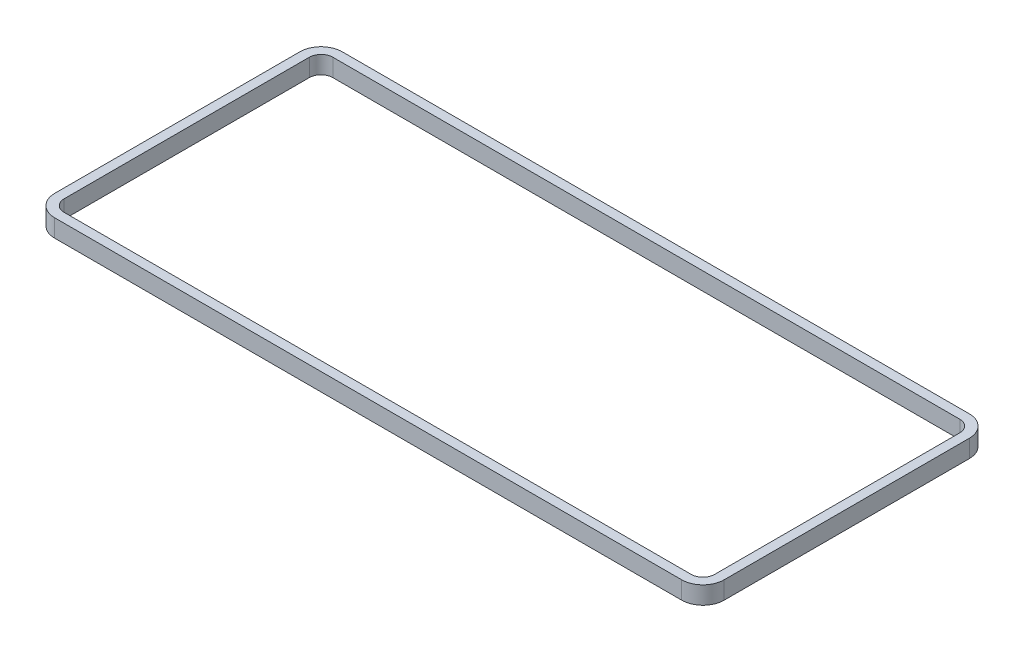
ISO-10303-21;
HEADER;
FILE_DESCRIPTION(('STEP AP214'),'2;1');
FILE_NAME('part.step','',(''),(''),'','','');
FILE_SCHEMA(('AUTOMOTIVE_DESIGN { 1 0 10303 214 1 1 1 1 }'));
ENDSEC;
DATA;
#1=APPLICATION_CONTEXT('core data for automotive mechanical design processes');
#2=APPLICATION_PROTOCOL_DEFINITION('international standard','automotive_design',2000,#1);
#3=PRODUCT_CONTEXT('',#1,'mechanical');
#4=PRODUCT('Part','Part','',(#3));
#5=PRODUCT_RELATED_PRODUCT_CATEGORY('part','',(#4));
#6=PRODUCT_DEFINITION_FORMATION('','',#4);
#7=PRODUCT_DEFINITION_CONTEXT('part definition',#1,'design');
#8=PRODUCT_DEFINITION('design','',#6,#7);
#9=PRODUCT_DEFINITION_SHAPE('','',#8);
#10=(LENGTH_UNIT() NAMED_UNIT(*) SI_UNIT(.MILLI.,.METRE.));
#11=(NAMED_UNIT(*) PLANE_ANGLE_UNIT() SI_UNIT($,.RADIAN.));
#12=(NAMED_UNIT(*) SI_UNIT($,.STERADIAN.) SOLID_ANGLE_UNIT());
#13=UNCERTAINTY_MEASURE_WITH_UNIT(LENGTH_MEASURE(1.E-05),#10,'distance_accuracy_value','');
#14=(GEOMETRIC_REPRESENTATION_CONTEXT(3) GLOBAL_UNCERTAINTY_ASSIGNED_CONTEXT((#13)) GLOBAL_UNIT_ASSIGNED_CONTEXT((#10,
#11,#12)) REPRESENTATION_CONTEXT('',''));
#15=CARTESIAN_POINT('',(0.,0.,0.));
#16=DIRECTION('',(0.,0.,1.));
#17=DIRECTION('',(1.,0.,0.));
#18=AXIS2_PLACEMENT_3D('',#15,#16,#17);
#19=CARTESIAN_POINT('',(182.199965226183,-20.9999251737758,-114.096000670839));
#20=DIRECTION('',(-1.,0.,0.));
#21=DIRECTION('',(0.,1.,0.));
#22=AXIS2_PLACEMENT_3D('',#19,#20,#21);
#23=PLANE('',#22);
#24=DIRECTION('',(0.,-1.,0.));
#25=VECTOR('',#24,1.);
#26=CARTESIAN_POINT('',(182.199965226183,-20.9999251737758,-70.5960006708393));
#27=LINE('',#26,#25);
#28=CARTESIAN_POINT('',(182.199965226183,-17.9999251737759,-70.5960006708393));
#29=VERTEX_POINT('',#28);
#30=CARTESIAN_POINT('',(182.199965226183,-20.9999251737758,-70.5960006708393));
#31=VERTEX_POINT('',#30);
#32=EDGE_CURVE('E28',#29,#31,#27,.T.);
#33=ORIENTED_EDGE('',*,*,#32,.F.);
#34=DIRECTION('',(0.,0.,1.));
#35=VECTOR('',#34,1.);
#36=CARTESIAN_POINT('',(182.199965226183,-17.9999251737758,-102.746000659597));
#37=LINE('',#36,#35);
#38=CARTESIAN_POINT('',(182.199965226183,-17.9999251737758,-112.196000670839));
#39=VERTEX_POINT('',#38);
#40=EDGE_CURVE('E221',#39,#29,#37,.T.);
#41=ORIENTED_EDGE('',*,*,#40,.F.);
#42=DIRECTION('',(0.,1.,0.));
#43=VECTOR('',#42,1.);
#44=CARTESIAN_POINT('',(182.199965226183,-20.9999251737758,-112.196000670839));
#45=LINE('',#44,#43);
#46=CARTESIAN_POINT('',(182.199965226183,-20.9999251737758,-112.196000670839));
#47=VERTEX_POINT('',#46);
#48=EDGE_CURVE('E11',#47,#39,#45,.T.);
#49=ORIENTED_EDGE('',*,*,#48,.F.);
#50=DIRECTION('',(0.,0.,-1.));
#51=VECTOR('',#50,1.);
#52=CARTESIAN_POINT('',(182.199965226183,-20.9999251737758,-102.746000659597));
#53=LINE('',#52,#51);
#54=EDGE_CURVE('E165',#31,#47,#53,.T.);
#55=ORIENTED_EDGE('',*,*,#54,.F.);
#56=EDGE_LOOP('',(#33,#41,#49,#55));
#57=FACE_BOUND('',#56,.T.);
#58=ADVANCED_FACE('F17',(#57),#23,.T.);
#59=CARTESIAN_POINT('',(180.199965226183,-20.9999251737758,-112.196000670839));
#60=DIRECTION('',(0.,1.,0.));
#61=DIRECTION('',(0.70710678118656,0.,-0.707106781186535));
#62=AXIS2_PLACEMENT_3D('',#59,#60,#61);
#63=CYLINDRICAL_SURFACE('',#62,2.);
#64=CARTESIAN_POINT('',(180.199965226183,-20.9999251737758,-112.196000670839));
#65=DIRECTION('',(0.,-1.,0.));
#66=DIRECTION('',(0.70710678118656,0.,-0.707106781186535));
#67=AXIS2_PLACEMENT_3D('',#64,#65,#66);
#68=CIRCLE('',#67,2.);
#69=CARTESIAN_POINT('',(180.199965226183,-20.9999251737758,-114.196000670839));
#70=VERTEX_POINT('',#69);
#71=EDGE_CURVE('E216',#70,#47,#68,.T.);
#72=ORIENTED_EDGE('',*,*,#71,.T.);
#73=ORIENTED_EDGE('',*,*,#48,.T.);
#74=CARTESIAN_POINT('',(180.199965226183,-17.9999251737758,-112.196000670839));
#75=DIRECTION('',(0.,1.,0.));
#76=DIRECTION('',(0.70710678118656,0.,-0.707106781186535));
#77=AXIS2_PLACEMENT_3D('',#74,#75,#76);
#78=CIRCLE('',#77,2.);
#79=CARTESIAN_POINT('',(180.199965226183,-17.9999251737758,-114.196000670839));
#80=VERTEX_POINT('',#79);
#81=EDGE_CURVE('E240',#39,#80,#78,.T.);
#82=ORIENTED_EDGE('',*,*,#81,.T.);
#83=DIRECTION('',(0.,-1.,0.));
#84=VECTOR('',#83,1.);
#85=CARTESIAN_POINT('',(180.199965226183,-20.9999251737758,-114.196000670839));
#86=LINE('',#85,#84);
#87=EDGE_CURVE('E178',#80,#70,#86,.T.);
#88=ORIENTED_EDGE('',*,*,#87,.T.);
#89=EDGE_LOOP('',(#72,#73,#82,#88));
#90=FACE_BOUND('',#89,.T.);
#91=ADVANCED_FACE('F316',(#90),#63,.F.);
#92=CARTESIAN_POINT('',(180.199965226183,-20.9999251737758,-70.5960006708393));
#93=DIRECTION('',(0.,1.,0.));
#94=DIRECTION('',(0.707106781186551,0.,0.707106781186544));
#95=AXIS2_PLACEMENT_3D('',#92,#93,#94);
#96=CYLINDRICAL_SURFACE('',#95,2.);
#97=CARTESIAN_POINT('',(180.199965226183,-20.9999251737758,-70.5960006708393));
#98=DIRECTION('',(0.,-1.,0.));
#99=DIRECTION('',(0.707106781186551,0.,0.707106781186544));
#100=AXIS2_PLACEMENT_3D('',#97,#98,#99);
#101=CIRCLE('',#100,2.);
#102=CARTESIAN_POINT('',(180.199965226183,-20.9999251737758,-68.5960006708393));
#103=VERTEX_POINT('',#102);
#104=EDGE_CURVE('E161',#31,#103,#101,.T.);
#105=ORIENTED_EDGE('',*,*,#104,.T.);
#106=DIRECTION('',(0.,1.,0.));
#107=VECTOR('',#106,1.);
#108=CARTESIAN_POINT('',(180.199965226183,-20.9999251737758,-68.5960006708393));
#109=LINE('',#108,#107);
#110=CARTESIAN_POINT('',(180.199965226183,-17.9999251737758,-68.5960006708393));
#111=VERTEX_POINT('',#110);
#112=EDGE_CURVE('E180',#103,#111,#109,.T.);
#113=ORIENTED_EDGE('',*,*,#112,.T.);
#114=CARTESIAN_POINT('',(180.199965226183,-17.9999251737758,-70.5960006708393));
#115=DIRECTION('',(0.,1.,0.));
#116=DIRECTION('',(0.707106781186551,0.,0.707106781186544));
#117=AXIS2_PLACEMENT_3D('',#114,#115,#116);
#118=CIRCLE('',#117,2.);
#119=EDGE_CURVE('E217',#111,#29,#118,.T.);
#120=ORIENTED_EDGE('',*,*,#119,.T.);
#121=ORIENTED_EDGE('',*,*,#32,.T.);
#122=EDGE_LOOP('',(#105,#113,#120,#121));
#123=FACE_BOUND('',#122,.T.);
#124=ADVANCED_FACE('F308',(#123),#96,.F.);
#125=CARTESIAN_POINT('',(182.099965226183,-20.9999251737758,-68.5960006708393));
#126=DIRECTION('',(0.,0.,-1.));
#127=DIRECTION('',(-1.,0.,0.));
#128=AXIS2_PLACEMENT_3D('',#125,#126,#127);
#129=PLANE('',#128);
#130=DIRECTION('',(0.,-1.,0.));
#131=VECTOR('',#130,1.);
#132=CARTESIAN_POINT('',(73.800080550188,-20.9999251737758,-68.5960006708393));
#133=LINE('',#132,#131);
#134=CARTESIAN_POINT('',(73.800080550188,-17.9999251737758,-68.5960006708393));
#135=VERTEX_POINT('',#134);
#136=CARTESIAN_POINT('',(73.800080550188,-20.9999251737758,-68.5960006708393));
#137=VERTEX_POINT('',#136);
#138=EDGE_CURVE('E177',#135,#137,#133,.T.);
#139=ORIENTED_EDGE('',*,*,#138,.F.);
#140=DIRECTION('',(-1.,0.,0.));
#141=VECTOR('',#140,1.);
#142=CARTESIAN_POINT('',(154.549994057184,-17.9999251737758,-68.5960006708393));
#143=LINE('',#142,#141);
#144=EDGE_CURVE('E170',#111,#135,#143,.T.);
#145=ORIENTED_EDGE('',*,*,#144,.F.);
#146=ORIENTED_EDGE('',*,*,#112,.F.);
#147=DIRECTION('',(1.,0.,0.));
#148=VECTOR('',#147,1.);
#149=CARTESIAN_POINT('',(154.549994057184,-20.9999251737758,-68.5960006708393));
#150=LINE('',#149,#148);
#151=EDGE_CURVE('E166',#137,#103,#150,.T.);
#152=ORIENTED_EDGE('',*,*,#151,.F.);
#153=EDGE_LOOP('',(#139,#145,#146,#152));
#154=FACE_BOUND('',#153,.T.);
#155=ADVANCED_FACE('F303',(#154),#129,.T.);
#156=CARTESIAN_POINT('',(71.900080550188,-20.9999251737758,-114.196000670839));
#157=DIRECTION('',(0.,0.,1.));
#158=DIRECTION('',(1.,0.,0.));
#159=AXIS2_PLACEMENT_3D('',#156,#157,#158);
#160=PLANE('',#159);
#161=DIRECTION('',(0.,1.,0.));
#162=VECTOR('',#161,1.);
#163=CARTESIAN_POINT('',(73.800080550188,-20.9999251737758,-114.196000670839));
#164=LINE('',#163,#162);
#165=CARTESIAN_POINT('',(73.800080550188,-20.9999251737758,-114.196000670839));
#166=VERTEX_POINT('',#165);
#167=CARTESIAN_POINT('',(73.800080550188,-17.9999251737758,-114.196000670839));
#168=VERTEX_POINT('',#167);
#169=EDGE_CURVE('E176',#166,#168,#164,.T.);
#170=ORIENTED_EDGE('',*,*,#169,.F.);
#171=DIRECTION('',(-1.,0.,0.));
#172=VECTOR('',#171,1.);
#173=CARTESIAN_POINT('',(99.4500517191868,-20.9999251737758,-114.196000670839));
#174=LINE('',#173,#172);
#175=EDGE_CURVE('E211',#70,#166,#174,.T.);
#176=ORIENTED_EDGE('',*,*,#175,.F.);
#177=ORIENTED_EDGE('',*,*,#87,.F.);
#178=DIRECTION('',(1.,0.,0.));
#179=VECTOR('',#178,1.);
#180=CARTESIAN_POINT('',(99.4500517191868,-17.9999251737758,-114.196000670839));
#181=LINE('',#180,#179);
#182=EDGE_CURVE('E186',#168,#80,#181,.T.);
#183=ORIENTED_EDGE('',*,*,#182,.F.);
#184=EDGE_LOOP('',(#170,#176,#177,#183));
#185=FACE_BOUND('',#184,.T.);
#186=ADVANCED_FACE('F359',(#185),#160,.T.);
#187=CARTESIAN_POINT('',(73.800080550188,-20.9999251737758,-112.196000670839));
#188=DIRECTION('',(0.,1.,0.));
#189=DIRECTION('',(-0.707106781186551,0.,-0.707106781186544));
#190=AXIS2_PLACEMENT_3D('',#187,#188,#189);
#191=CYLINDRICAL_SURFACE('',#190,2.);
#192=CARTESIAN_POINT('',(73.800080550188,-20.9999251737758,-112.196000670839));
#193=DIRECTION('',(0.,-1.,0.));
#194=DIRECTION('',(-0.707106781186551,0.,-0.707106781186544));
#195=AXIS2_PLACEMENT_3D('',#192,#193,#194);
#196=CIRCLE('',#195,2.);
#197=CARTESIAN_POINT('',(71.800080550188,-20.9999251737758,-112.196000670839));
#198=VERTEX_POINT('',#197);
#199=EDGE_CURVE('E215',#198,#166,#196,.T.);
#200=ORIENTED_EDGE('',*,*,#199,.T.);
#201=ORIENTED_EDGE('',*,*,#169,.T.);
#202=CARTESIAN_POINT('',(73.800080550188,-17.9999251737758,-112.196000670839));
#203=DIRECTION('',(0.,1.,0.));
#204=DIRECTION('',(-0.707106781186551,0.,-0.707106781186544));
#205=AXIS2_PLACEMENT_3D('',#202,#203,#204);
#206=CIRCLE('',#205,2.);
#207=CARTESIAN_POINT('',(71.800080550188,-17.9999251737758,-112.196000670839));
#208=VERTEX_POINT('',#207);
#209=EDGE_CURVE('E182',#168,#208,#206,.T.);
#210=ORIENTED_EDGE('',*,*,#209,.T.);
#211=DIRECTION('',(0.,-1.,0.));
#212=VECTOR('',#211,1.);
#213=CARTESIAN_POINT('',(71.800080550188,-20.9999251737758,-112.196000670839));
#214=LINE('',#213,#212);
#215=EDGE_CURVE('E172',#208,#198,#214,.T.);
#216=ORIENTED_EDGE('',*,*,#215,.T.);
#217=EDGE_LOOP('',(#200,#201,#210,#216));
#218=FACE_BOUND('',#217,.T.);
#219=ADVANCED_FACE('F361',(#218),#191,.F.);
#220=CARTESIAN_POINT('',(71.800080550188,-20.9999251737758,-68.6960006708393));
#221=DIRECTION('',(1.,0.,0.));
#222=DIRECTION('',(0.,0.,-1.));
#223=AXIS2_PLACEMENT_3D('',#220,#221,#222);
#224=PLANE('',#223);
#225=DIRECTION('',(0.,1.,0.));
#226=VECTOR('',#225,1.);
#227=CARTESIAN_POINT('',(71.800080550188,-20.9999251737758,-70.5960006708393));
#228=LINE('',#227,#226);
#229=CARTESIAN_POINT('',(71.800080550188,-20.9999251737758,-70.5960006708393));
#230=VERTEX_POINT('',#229);
#231=CARTESIAN_POINT('',(71.800080550188,-17.9999251737758,-70.5960006708393));
#232=VERTEX_POINT('',#231);
#233=EDGE_CURVE('E267',#230,#232,#228,.T.);
#234=ORIENTED_EDGE('',*,*,#233,.F.);
#235=DIRECTION('',(0.,0.,1.));
#236=VECTOR('',#235,1.);
#237=CARTESIAN_POINT('',(71.800080550188,-20.9999251737758,-80.0460006595968));
#238=LINE('',#237,#236);
#239=EDGE_CURVE('E159',#198,#230,#238,.T.);
#240=ORIENTED_EDGE('',*,*,#239,.F.);
#241=ORIENTED_EDGE('',*,*,#215,.F.);
#242=DIRECTION('',(0.,0.,-1.));
#243=VECTOR('',#242,1.);
#244=CARTESIAN_POINT('',(71.800080550188,-17.9999251737758,-80.0460006595968));
#245=LINE('',#244,#243);
#246=EDGE_CURVE('E187',#232,#208,#245,.T.);
#247=ORIENTED_EDGE('',*,*,#246,.F.);
#248=EDGE_LOOP('',(#234,#240,#241,#247));
#249=FACE_BOUND('',#248,.T.);
#250=ADVANCED_FACE('F363',(#249),#224,.T.);
#251=CARTESIAN_POINT('',(73.800080550188,-20.9999251737758,-70.5960006708393));
#252=DIRECTION('',(0.,1.,0.));
#253=DIRECTION('',(-0.707106781186548,0.,0.707106781186548));
#254=AXIS2_PLACEMENT_3D('',#251,#252,#253);
#255=CYLINDRICAL_SURFACE('',#254,2.);
#256=CARTESIAN_POINT('',(73.800080550188,-20.9999251737758,-70.5960006708393));
#257=DIRECTION('',(0.,-1.,0.));
#258=DIRECTION('',(-0.707106781186548,0.,0.707106781186548));
#259=AXIS2_PLACEMENT_3D('',#256,#257,#258);
#260=CIRCLE('',#259,2.);
#261=EDGE_CURVE('E239',#137,#230,#260,.T.);
#262=ORIENTED_EDGE('',*,*,#261,.T.);
#263=ORIENTED_EDGE('',*,*,#233,.T.);
#264=CARTESIAN_POINT('',(73.800080550188,-17.9999251737758,-70.5960006708393));
#265=DIRECTION('',(0.,1.,0.));
#266=DIRECTION('',(-0.707106781186548,0.,0.707106781186548));
#267=AXIS2_PLACEMENT_3D('',#264,#265,#266);
#268=CIRCLE('',#267,2.);
#269=EDGE_CURVE('E234',#232,#135,#268,.T.);
#270=ORIENTED_EDGE('',*,*,#269,.T.);
#271=ORIENTED_EDGE('',*,*,#138,.T.);
#272=EDGE_LOOP('',(#262,#263,#270,#271));
#273=FACE_BOUND('',#272,.T.);
#274=ADVANCED_FACE('F289',(#273),#255,.F.);
#275=CARTESIAN_POINT('',(73.800080550188,-20.9999251737758,-112.196000670839));
#276=DIRECTION('',(0.,1.,0.));
#277=DIRECTION('',(-0.707106781186549,0.,-0.707106781186546));
#278=AXIS2_PLACEMENT_3D('',#275,#276,#277);
#279=CYLINDRICAL_SURFACE('',#278,3.6);
#280=CARTESIAN_POINT('',(73.800080550188,-17.9999251737758,-112.196000670839));
#281=DIRECTION('',(0.,-1.,0.));
#282=DIRECTION('',(-0.707106781186549,0.,-0.707106781186546));
#283=AXIS2_PLACEMENT_3D('',#280,#281,#282);
#284=CIRCLE('',#283,3.6);
#285=CARTESIAN_POINT('',(70.200080550188,-17.9999251737758,-112.196000670839));
#286=VERTEX_POINT('',#285);
#287=CARTESIAN_POINT('',(73.800080550188,-17.9999251737758,-115.796000670839));
#288=VERTEX_POINT('',#287);
#289=EDGE_CURVE('E116',#286,#288,#284,.T.);
#290=ORIENTED_EDGE('',*,*,#289,.T.);
#291=DIRECTION('',(0.,-1.,0.));
#292=VECTOR('',#291,1.);
#293=CARTESIAN_POINT('',(73.800080550188,-20.9999251737758,-115.796000670839));
#294=LINE('',#293,#292);
#295=CARTESIAN_POINT('',(73.800080550188,-20.9999251737758,-115.796000670839));
#296=VERTEX_POINT('',#295);
#297=EDGE_CURVE('E121',#288,#296,#294,.T.);
#298=ORIENTED_EDGE('',*,*,#297,.T.);
#299=CARTESIAN_POINT('',(73.800080550188,-20.9999251737758,-112.196000670839));
#300=DIRECTION('',(0.,1.,0.));
#301=DIRECTION('',(-0.707106781186549,0.,-0.707106781186546));
#302=AXIS2_PLACEMENT_3D('',#299,#300,#301);
#303=CIRCLE('',#302,3.6);
#304=CARTESIAN_POINT('',(70.200080550188,-20.9999251737758,-112.196000670839));
#305=VERTEX_POINT('',#304);
#306=EDGE_CURVE('E197',#296,#305,#303,.T.);
#307=ORIENTED_EDGE('',*,*,#306,.T.);
#308=DIRECTION('',(0.,1.,0.));
#309=VECTOR('',#308,1.);
#310=CARTESIAN_POINT('',(70.200080550188,-20.9999251737758,-112.196000670839));
#311=LINE('',#310,#309);
#312=EDGE_CURVE('E123',#305,#286,#311,.T.);
#313=ORIENTED_EDGE('',*,*,#312,.T.);
#314=EDGE_LOOP('',(#290,#298,#307,#313));
#315=FACE_BOUND('',#314,.T.);
#316=ADVANCED_FACE('F118',(#315),#279,.T.);
#317=CARTESIAN_POINT('',(70.200080550188,-20.9999251737758,-114.896000670839));
#318=DIRECTION('',(-1.,0.,0.));
#319=DIRECTION('',(0.,1.,0.));
#320=AXIS2_PLACEMENT_3D('',#317,#318,#319);
#321=PLANE('',#320);
#322=DIRECTION('',(0.,-1.,0.));
#323=VECTOR('',#322,1.);
#324=CARTESIAN_POINT('',(70.200080550188,-20.9999251737758,-70.5960006708393));
#325=LINE('',#324,#323);
#326=CARTESIAN_POINT('',(70.200080550188,-17.9999251737758,-70.5960006708393));
#327=VERTEX_POINT('',#326);
#328=CARTESIAN_POINT('',(70.200080550188,-20.9999251737758,-70.5960006708393));
#329=VERTEX_POINT('',#328);
#330=EDGE_CURVE('E266',#327,#329,#325,.T.);
#331=ORIENTED_EDGE('',*,*,#330,.F.);
#332=DIRECTION('',(0.,0.,1.));
#333=VECTOR('',#332,1.);
#334=CARTESIAN_POINT('',(70.200080550188,-17.9999251737758,-103.146000659597));
#335=LINE('',#334,#333);
#336=EDGE_CURVE('E128',#286,#327,#335,.T.);
#337=ORIENTED_EDGE('',*,*,#336,.F.);
#338=ORIENTED_EDGE('',*,*,#312,.F.);
#339=DIRECTION('',(0.,0.,1.));
#340=VECTOR('',#339,1.);
#341=CARTESIAN_POINT('',(70.200080550188,-20.9999251737758,-103.146000659597));
#342=LINE('',#341,#340);
#343=EDGE_CURVE('E193',#305,#329,#342,.T.);
#344=ORIENTED_EDGE('',*,*,#343,.T.);
#345=EDGE_LOOP('',(#331,#337,#338,#344));
#346=FACE_BOUND('',#345,.T.);
#347=ADVANCED_FACE('F390',(#346),#321,.T.);
#348=CARTESIAN_POINT('',(73.800080550188,-20.9999251737758,-70.5960006708393));
#349=DIRECTION('',(0.,-1.,0.));
#350=DIRECTION('',(-0.707106781186546,0.,0.707106781186549));
#351=AXIS2_PLACEMENT_3D('',#348,#349,#350);
#352=CYLINDRICAL_SURFACE('',#351,3.6);
#353=CARTESIAN_POINT('',(73.800080550188,-20.9999251737758,-70.5960006708393));
#354=DIRECTION('',(0.,1.,0.));
#355=DIRECTION('',(-0.707106781186546,0.,0.707106781186549));
#356=AXIS2_PLACEMENT_3D('',#353,#354,#355);
#357=CIRCLE('',#356,3.6);
#358=CARTESIAN_POINT('',(73.800080550188,-20.9999251737758,-66.9960006708393));
#359=VERTEX_POINT('',#358);
#360=EDGE_CURVE('E198',#329,#359,#357,.T.);
#361=ORIENTED_EDGE('',*,*,#360,.T.);
#362=DIRECTION('',(0.,1.,0.));
#363=VECTOR('',#362,1.);
#364=CARTESIAN_POINT('',(73.800080550188,-20.9999251737758,-66.9960006708393));
#365=LINE('',#364,#363);
#366=CARTESIAN_POINT('',(73.800080550188,-17.9999251737758,-66.9960006708393));
#367=VERTEX_POINT('',#366);
#368=EDGE_CURVE('E220',#359,#367,#365,.T.);
#369=ORIENTED_EDGE('',*,*,#368,.T.);
#370=CARTESIAN_POINT('',(73.800080550188,-17.9999251737758,-70.5960006708393));
#371=DIRECTION('',(0.,-1.,0.));
#372=DIRECTION('',(-0.707106781186546,0.,0.707106781186549));
#373=AXIS2_PLACEMENT_3D('',#370,#371,#372);
#374=CIRCLE('',#373,3.6);
#375=EDGE_CURVE('E171',#367,#327,#374,.T.);
#376=ORIENTED_EDGE('',*,*,#375,.T.);
#377=ORIENTED_EDGE('',*,*,#330,.T.);
#378=EDGE_LOOP('',(#361,#369,#376,#377));
#379=FACE_BOUND('',#378,.T.);
#380=ADVANCED_FACE('F395',(#379),#352,.T.);
#381=CARTESIAN_POINT('',(71.100080550188,-20.9999251737758,-66.9960006708393));
#382=DIRECTION('',(0.,0.,1.));
#383=DIRECTION('',(1.,0.,0.));
#384=AXIS2_PLACEMENT_3D('',#381,#382,#383);
#385=PLANE('',#384);
#386=DIRECTION('',(0.,-1.,0.));
#387=VECTOR('',#386,1.);
#388=CARTESIAN_POINT('',(180.199965226183,-20.9999251737758,-66.9960006708393));
#389=LINE('',#388,#387);
#390=CARTESIAN_POINT('',(180.199965226183,-17.9999251737758,-66.9960006708393));
#391=VERTEX_POINT('',#390);
#392=CARTESIAN_POINT('',(180.199965226183,-20.9999251737758,-66.9960006708393));
#393=VERTEX_POINT('',#392);
#394=EDGE_CURVE('E129',#391,#393,#389,.T.);
#395=ORIENTED_EDGE('',*,*,#394,.F.);
#396=DIRECTION('',(1.,0.,0.));
#397=VECTOR('',#396,1.);
#398=CARTESIAN_POINT('',(99.0500517191868,-17.9999251737758,-66.9960006708393));
#399=LINE('',#398,#397);
#400=EDGE_CURVE('E167',#367,#391,#399,.T.);
#401=ORIENTED_EDGE('',*,*,#400,.F.);
#402=ORIENTED_EDGE('',*,*,#368,.F.);
#403=DIRECTION('',(1.,0.,0.));
#404=VECTOR('',#403,1.);
#405=CARTESIAN_POINT('',(99.0500517191868,-20.9999251737758,-66.9960006708393));
#406=LINE('',#405,#404);
#407=EDGE_CURVE('E206',#359,#393,#406,.T.);
#408=ORIENTED_EDGE('',*,*,#407,.T.);
#409=EDGE_LOOP('',(#395,#401,#402,#408));
#410=FACE_BOUND('',#409,.T.);
#411=ADVANCED_FACE('F384',(#410),#385,.T.);
#412=CARTESIAN_POINT('',(127.000022888185,-17.9999251737758,-91.3960006483544));
#413=DIRECTION('',(0.,-1.,0.));
#414=DIRECTION('',(0.,0.,-1.));
#415=AXIS2_PLACEMENT_3D('',#412,#413,#414);
#416=PLANE('',#415);
#417=ORIENTED_EDGE('',*,*,#144,.T.);
#418=ORIENTED_EDGE('',*,*,#269,.F.);
#419=ORIENTED_EDGE('',*,*,#246,.T.);
#420=ORIENTED_EDGE('',*,*,#209,.F.);
#421=ORIENTED_EDGE('',*,*,#182,.T.);
#422=ORIENTED_EDGE('',*,*,#81,.F.);
#423=ORIENTED_EDGE('',*,*,#40,.T.);
#424=ORIENTED_EDGE('',*,*,#119,.F.);
#425=EDGE_LOOP('',(#417,#418,#419,#420,#421,#422,#423,#424));
#426=FACE_BOUND('',#425,.T.);
#427=CARTESIAN_POINT('',(180.199965226183,-17.9999251737758,-112.196000670839));
#428=DIRECTION('',(0.,-1.,0.));
#429=DIRECTION('',(0.707106781186541,0.,-0.707106781186554));
#430=AXIS2_PLACEMENT_3D('',#427,#428,#429);
#431=CIRCLE('',#430,3.6);
#432=CARTESIAN_POINT('',(180.199965226183,-17.9999251737758,-115.796000670839));
#433=VERTEX_POINT('',#432);
#434=CARTESIAN_POINT('',(183.799965226183,-17.9999251737758,-112.196000670839));
#435=VERTEX_POINT('',#434);
#436=EDGE_CURVE('E138',#433,#435,#431,.T.);
#437=ORIENTED_EDGE('',*,*,#436,.F.);
#438=DIRECTION('',(-1.,0.,0.));
#439=VECTOR('',#438,1.);
#440=CARTESIAN_POINT('',(154.949994057184,-17.9999251737758,-115.796000670839));
#441=LINE('',#440,#439);
#442=EDGE_CURVE('E133',#433,#288,#441,.T.);
#443=ORIENTED_EDGE('',*,*,#442,.T.);
#444=ORIENTED_EDGE('',*,*,#289,.F.);
#445=ORIENTED_EDGE('',*,*,#336,.T.);
#446=ORIENTED_EDGE('',*,*,#375,.F.);
#447=ORIENTED_EDGE('',*,*,#400,.T.);
#448=CARTESIAN_POINT('',(180.199965226183,-17.9999251737758,-70.5960006708393));
#449=DIRECTION('',(0.,-1.,0.));
#450=DIRECTION('',(0.707106781186548,0.,0.707106781186548));
#451=AXIS2_PLACEMENT_3D('',#448,#449,#450);
#452=CIRCLE('',#451,3.6);
#453=CARTESIAN_POINT('',(183.799965226183,-17.9999251737759,-70.5960006708393));
#454=VERTEX_POINT('',#453);
#455=EDGE_CURVE('E21',#454,#391,#452,.T.);
#456=ORIENTED_EDGE('',*,*,#455,.F.);
#457=DIRECTION('',(0.,0.,-1.));
#458=VECTOR('',#457,1.);
#459=CARTESIAN_POINT('',(183.799965226183,-17.9999251737758,-79.6460006595969));
#460=LINE('',#459,#458);
#461=EDGE_CURVE('E155',#454,#435,#460,.T.);
#462=ORIENTED_EDGE('',*,*,#461,.T.);
#463=EDGE_LOOP('',(#437,#443,#444,#445,#446,#447,#456,#462));
#464=FACE_BOUND('',#463,.T.);
#465=ADVANCED_FACE('F134',(#426,#464),#416,.F.);
#466=CARTESIAN_POINT('',(180.199965226183,-20.9999251737758,-70.5960006708393));
#467=DIRECTION('',(0.,-1.,0.));
#468=DIRECTION('',(0.707106781186548,0.,0.707106781186548));
#469=AXIS2_PLACEMENT_3D('',#466,#467,#468);
#470=CYLINDRICAL_SURFACE('',#469,3.6);
#471=CARTESIAN_POINT('',(180.199965226183,-20.9999251737758,-70.5960006708393));
#472=DIRECTION('',(0.,1.,0.));
#473=DIRECTION('',(0.707106781186548,0.,0.707106781186548));
#474=AXIS2_PLACEMENT_3D('',#471,#472,#473);
#475=CIRCLE('',#474,3.6);
#476=CARTESIAN_POINT('',(183.799965226183,-20.9999251737758,-70.5960006708393));
#477=VERTEX_POINT('',#476);
#478=EDGE_CURVE('E210',#393,#477,#475,.T.);
#479=ORIENTED_EDGE('',*,*,#478,.T.);
#480=DIRECTION('',(0.,1.,0.));
#481=VECTOR('',#480,1.);
#482=CARTESIAN_POINT('',(183.799965226183,-20.9999251737758,-70.5960006708393));
#483=LINE('',#482,#481);
#484=EDGE_CURVE('E148',#477,#454,#483,.T.);
#485=ORIENTED_EDGE('',*,*,#484,.T.);
#486=ORIENTED_EDGE('',*,*,#455,.T.);
#487=ORIENTED_EDGE('',*,*,#394,.T.);
#488=EDGE_LOOP('',(#479,#485,#486,#487));
#489=FACE_BOUND('',#488,.T.);
#490=ADVANCED_FACE('F383',(#489),#470,.T.);
#491=CARTESIAN_POINT('',(182.899965226183,-20.9999251737758,-115.796000670839));
#492=DIRECTION('',(0.,0.,-1.));
#493=DIRECTION('',(-1.,0.,0.));
#494=AXIS2_PLACEMENT_3D('',#491,#492,#493);
#495=PLANE('',#494);
#496=DIRECTION('',(0.,1.,0.));
#497=VECTOR('',#496,1.);
#498=CARTESIAN_POINT('',(180.199965226183,-20.9999251737758,-115.796000670839));
#499=LINE('',#498,#497);
#500=CARTESIAN_POINT('',(180.199965226183,-20.9999251737758,-115.796000670839));
#501=VERTEX_POINT('',#500);
#502=EDGE_CURVE('E199',#501,#433,#499,.T.);
#503=ORIENTED_EDGE('',*,*,#502,.F.);
#504=DIRECTION('',(-1.,0.,0.));
#505=VECTOR('',#504,1.);
#506=CARTESIAN_POINT('',(154.949994057184,-20.9999251737758,-115.796000670839));
#507=LINE('',#506,#505);
#508=EDGE_CURVE('E145',#501,#296,#507,.T.);
#509=ORIENTED_EDGE('',*,*,#508,.T.);
#510=ORIENTED_EDGE('',*,*,#297,.F.);
#511=ORIENTED_EDGE('',*,*,#442,.F.);
#512=EDGE_LOOP('',(#503,#509,#510,#511));
#513=FACE_BOUND('',#512,.T.);
#514=ADVANCED_FACE('F144',(#513),#495,.T.);
#515=CARTESIAN_POINT('',(183.799965226183,-20.9999251737759,-67.8960006708393));
#516=DIRECTION('',(1.,0.,0.));
#517=DIRECTION('',(0.,0.,-1.));
#518=AXIS2_PLACEMENT_3D('',#515,#516,#517);
#519=PLANE('',#518);
#520=DIRECTION('',(0.,-1.,0.));
#521=VECTOR('',#520,1.);
#522=CARTESIAN_POINT('',(183.799965226183,-20.9999251737758,-112.196000670839));
#523=LINE('',#522,#521);
#524=CARTESIAN_POINT('',(183.799965226183,-20.9999251737758,-112.196000670839));
#525=VERTEX_POINT('',#524);
#526=EDGE_CURVE('E188',#435,#525,#523,.T.);
#527=ORIENTED_EDGE('',*,*,#526,.F.);
#528=ORIENTED_EDGE('',*,*,#461,.F.);
#529=ORIENTED_EDGE('',*,*,#484,.F.);
#530=DIRECTION('',(0.,0.,-1.));
#531=VECTOR('',#530,1.);
#532=CARTESIAN_POINT('',(183.799965226183,-20.9999251737758,-79.6460006595969));
#533=LINE('',#532,#531);
#534=EDGE_CURVE('E202',#477,#525,#533,.T.);
#535=ORIENTED_EDGE('',*,*,#534,.T.);
#536=EDGE_LOOP('',(#527,#528,#529,#535));
#537=FACE_BOUND('',#536,.T.);
#538=ADVANCED_FACE('F402',(#537),#519,.T.);
#539=CARTESIAN_POINT('',(127.000022888185,-20.9999251737758,-91.3960006483544));
#540=DIRECTION('',(0.,-1.,0.));
#541=DIRECTION('',(0.,0.,-1.));
#542=AXIS2_PLACEMENT_3D('',#539,#540,#541);
#543=PLANE('',#542);
#544=ORIENTED_EDGE('',*,*,#151,.T.);
#545=ORIENTED_EDGE('',*,*,#104,.F.);
#546=ORIENTED_EDGE('',*,*,#54,.T.);
#547=ORIENTED_EDGE('',*,*,#71,.F.);
#548=ORIENTED_EDGE('',*,*,#175,.T.);
#549=ORIENTED_EDGE('',*,*,#199,.F.);
#550=ORIENTED_EDGE('',*,*,#239,.T.);
#551=ORIENTED_EDGE('',*,*,#261,.F.);
#552=EDGE_LOOP('',(#544,#545,#546,#547,#548,#549,#550,#551));
#553=FACE_BOUND('',#552,.T.);
#554=CARTESIAN_POINT('',(180.199965226183,-20.9999251737758,-112.196000670839));
#555=DIRECTION('',(0.,1.,0.));
#556=DIRECTION('',(0.707106781186541,0.,-0.707106781186554));
#557=AXIS2_PLACEMENT_3D('',#554,#555,#556);
#558=CIRCLE('',#557,3.6);
#559=EDGE_CURVE('E192',#525,#501,#558,.T.);
#560=ORIENTED_EDGE('',*,*,#559,.F.);
#561=ORIENTED_EDGE('',*,*,#534,.F.);
#562=ORIENTED_EDGE('',*,*,#478,.F.);
#563=ORIENTED_EDGE('',*,*,#407,.F.);
#564=ORIENTED_EDGE('',*,*,#360,.F.);
#565=ORIENTED_EDGE('',*,*,#343,.F.);
#566=ORIENTED_EDGE('',*,*,#306,.F.);
#567=ORIENTED_EDGE('',*,*,#508,.F.);
#568=EDGE_LOOP('',(#560,#561,#562,#563,#564,#565,#566,#567));
#569=FACE_BOUND('',#568,.T.);
#570=ADVANCED_FACE('F297',(#553,#569),#543,.T.);
#571=CARTESIAN_POINT('',(180.199965226183,-20.9999251737758,-112.196000670839));
#572=DIRECTION('',(0.,1.,0.));
#573=DIRECTION('',(0.707106781186541,0.,-0.707106781186554));
#574=AXIS2_PLACEMENT_3D('',#571,#572,#573);
#575=CYLINDRICAL_SURFACE('',#574,3.6);
#576=ORIENTED_EDGE('',*,*,#436,.T.);
#577=ORIENTED_EDGE('',*,*,#526,.T.);
#578=ORIENTED_EDGE('',*,*,#559,.T.);
#579=ORIENTED_EDGE('',*,*,#502,.T.);
#580=EDGE_LOOP('',(#576,#577,#578,#579));
#581=FACE_BOUND('',#580,.T.);
#582=ADVANCED_FACE('F19',(#581),#575,.T.);
#583=CLOSED_SHELL('',(#58,#91,#124,#155,#186,#219,#250,#274,#316,#347,#380,#411,#465,#490,#514,
#538,#570,#582));
#584=MANIFOLD_SOLID_BREP('B1',#583);
#585=ADVANCED_BREP_SHAPE_REPRESENTATION('',(#18,#584),#14);
#586=SHAPE_DEFINITION_REPRESENTATION(#9,#585);
ENDSEC;
END-ISO-10303-21;
